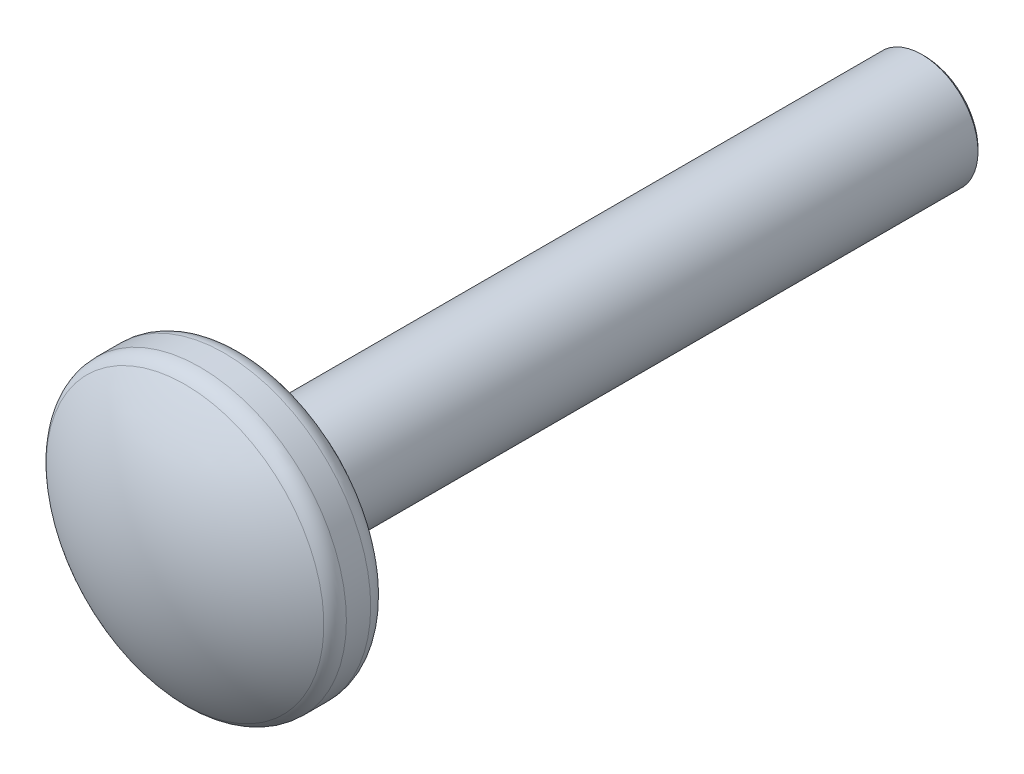
ISO-10303-21;
HEADER;
FILE_DESCRIPTION(('STEP AP214'),'2;1');
FILE_NAME('part.step','',(''),(''),'','','');
FILE_SCHEMA(('AUTOMOTIVE_DESIGN { 1 0 10303 214 1 1 1 1 }'));
ENDSEC;
DATA;
#1=APPLICATION_CONTEXT('core data for automotive mechanical design processes');
#2=APPLICATION_PROTOCOL_DEFINITION('international standard','automotive_design',2000,#1);
#3=PRODUCT_CONTEXT('',#1,'mechanical');
#4=PRODUCT('Part','Part','',(#3));
#5=PRODUCT_RELATED_PRODUCT_CATEGORY('part','',(#4));
#6=PRODUCT_DEFINITION_FORMATION('','',#4);
#7=PRODUCT_DEFINITION_CONTEXT('part definition',#1,'design');
#8=PRODUCT_DEFINITION('design','',#6,#7);
#9=PRODUCT_DEFINITION_SHAPE('','',#8);
#10=(LENGTH_UNIT() NAMED_UNIT(*) SI_UNIT(.MILLI.,.METRE.));
#11=(NAMED_UNIT(*) PLANE_ANGLE_UNIT() SI_UNIT($,.RADIAN.));
#12=(NAMED_UNIT(*) SI_UNIT($,.STERADIAN.) SOLID_ANGLE_UNIT());
#13=UNCERTAINTY_MEASURE_WITH_UNIT(LENGTH_MEASURE(1.E-05),#10,'distance_accuracy_value','');
#14=(GEOMETRIC_REPRESENTATION_CONTEXT(3) GLOBAL_UNCERTAINTY_ASSIGNED_CONTEXT((#13)) GLOBAL_UNIT_ASSIGNED_CONTEXT((#10,
#11,#12)) REPRESENTATION_CONTEXT('',''));
#15=CARTESIAN_POINT('',(0.,0.,0.));
#16=DIRECTION('',(0.,0.,1.));
#17=DIRECTION('',(1.,0.,0.));
#18=AXIS2_PLACEMENT_3D('',#15,#16,#17);
#19=CARTESIAN_POINT('',(0.,0.,18.309669552659));
#20=DIRECTION('',(0.,0.,1.));
#21=DIRECTION('',(1.,0.,0.));
#22=AXIS2_PLACEMENT_3D('',#19,#20,#21);
#23=CYLINDRICAL_SURFACE('',#22,2.69078433849527);
#24=DIRECTION('',(0.,0.,1.));
#25=VECTOR('',#24,1.);
#26=CARTESIAN_POINT('',(0.508,2.64239594994607,18.309669552659));
#27=LINE('',#26,#25);
#28=CARTESIAN_POINT('',(0.508,2.64239594994607,18.309669552659));
#29=VERTEX_POINT('',#28);
#30=CARTESIAN_POINT('',(0.508,2.64239594994607,18.893869552659));
#31=VERTEX_POINT('',#30);
#32=EDGE_CURVE('E63',#29,#31,#27,.T.);
#33=ORIENTED_EDGE('',*,*,#32,.T.);
#34=CARTESIAN_POINT('',(0.,0.,18.893869552659));
#35=DIRECTION('',(0.,0.,1.));
#36=DIRECTION('',(1.,0.,0.));
#37=AXIS2_PLACEMENT_3D('',#34,#35,#36);
#38=CIRCLE('',#37,2.69078433849527);
#39=CARTESIAN_POINT('',(-0.508,2.64239594994607,18.893869552659));
#40=VERTEX_POINT('',#39);
#41=EDGE_CURVE('E50',#40,#31,#38,.T.);
#42=ORIENTED_EDGE('',*,*,#41,.F.);
#43=DIRECTION('',(0.,0.,1.));
#44=VECTOR('',#43,1.);
#45=CARTESIAN_POINT('',(-0.508,2.64239594994607,18.309669552659));
#46=LINE('',#45,#44);
#47=CARTESIAN_POINT('',(-0.508,2.64239594991977,18.309669552659));
#48=VERTEX_POINT('',#47);
#49=EDGE_CURVE('E108',#40,#48,#46,.F.);
#50=ORIENTED_EDGE('',*,*,#49,.T.);
#51=CARTESIAN_POINT('',(0.,0.,18.309669552659));
#52=DIRECTION('',(0.,0.,1.));
#53=DIRECTION('',(1.,0.,0.));
#54=AXIS2_PLACEMENT_3D('',#51,#52,#53);
#55=CIRCLE('',#54,2.69078433849527);
#56=EDGE_CURVE('E13',#48,#29,#55,.T.);
#57=ORIENTED_EDGE('',*,*,#56,.T.);
#58=EDGE_LOOP('',(#33,#42,#50,#57));
#59=FACE_BOUND('',#58,.T.);
#60=ADVANCED_FACE('F47',(#59),#23,.T.);
#61=CARTESIAN_POINT('',(0.,0.,18.309669552659));
#62=DIRECTION('',(0.,0.,1.));
#63=DIRECTION('',(1.,0.,0.));
#64=AXIS2_PLACEMENT_3D('',#61,#62,#63);
#65=PLANE('',#64);
#66=CARTESIAN_POINT('',(0.,0.,18.309669552659));
#67=DIRECTION('',(0.,0.,1.));
#68=DIRECTION('',(1.,0.,0.));
#69=AXIS2_PLACEMENT_3D('',#66,#67,#68);
#70=CIRCLE('',#69,1.56724425180957);
#71=CARTESIAN_POINT('',(1.56724425180957,0.,18.309669552659));
#72=VERTEX_POINT('',#71);
#73=EDGE_CURVE('E119',#72,#72,#70,.T.);
#74=ORIENTED_EDGE('',*,*,#73,.T.);
#75=EDGE_LOOP('',(#74));
#76=FACE_BOUND('',#75,.T.);
#77=ORIENTED_EDGE('',*,*,#56,.F.);
#78=DIRECTION('',(0.,1.,0.));
#79=VECTOR('',#78,1.);
#80=CARTESIAN_POINT('',(-0.508,-500000.,18.309669552659));
#81=LINE('',#80,#79);
#82=CARTESIAN_POINT('',(-0.508,2.69078433849527,18.309669552659));
#83=VERTEX_POINT('',#82);
#84=EDGE_CURVE('E89',#48,#83,#81,.T.);
#85=ORIENTED_EDGE('',*,*,#84,.T.);
#86=DIRECTION('',(-1.,0.,0.));
#87=VECTOR('',#86,1.);
#88=CARTESIAN_POINT('',(0.508,2.69078433849527,18.309669552659));
#89=LINE('',#88,#87);
#90=CARTESIAN_POINT('',(0.508,2.69078433849527,18.309669552659));
#91=VERTEX_POINT('',#90);
#92=EDGE_CURVE('E85',#91,#83,#89,.T.);
#93=ORIENTED_EDGE('',*,*,#92,.F.);
#94=DIRECTION('',(0.,1.,0.));
#95=VECTOR('',#94,1.);
#96=CARTESIAN_POINT('',(0.508,-500000.,18.309669552659));
#97=LINE('',#96,#95);
#98=EDGE_CURVE('E88',#29,#91,#97,.T.);
#99=ORIENTED_EDGE('',*,*,#98,.F.);
#100=EDGE_LOOP('',(#77,#85,#93,#99));
#101=FACE_BOUND('',#100,.T.);
#102=ADVANCED_FACE('F87',(#76,#101),#65,.F.);
#103=CARTESIAN_POINT('',(0.,0.,18.893869552659));
#104=DIRECTION('',(0.,0.,1.));
#105=DIRECTION('',(1.,0.,0.));
#106=AXIS2_PLACEMENT_3D('',#103,#104,#105);
#107=PLANE('',#106);
#108=CARTESIAN_POINT('',(0.,0.,18.893869552659));
#109=DIRECTION('',(0.,0.,1.));
#110=DIRECTION('',(1.,0.,0.));
#111=AXIS2_PLACEMENT_3D('',#108,#109,#110);
#112=CIRCLE('',#111,1.56724425180957);
#113=CARTESIAN_POINT('',(1.56724425180957,0.,18.893869552659));
#114=VERTEX_POINT('',#113);
#115=EDGE_CURVE('E94',#114,#114,#112,.T.);
#116=ORIENTED_EDGE('',*,*,#115,.F.);
#117=EDGE_LOOP('',(#116));
#118=FACE_BOUND('',#117,.T.);
#119=ORIENTED_EDGE('',*,*,#41,.T.);
#120=DIRECTION('',(0.,1.,0.));
#121=VECTOR('',#120,1.);
#122=CARTESIAN_POINT('',(0.508,-500000.,18.893869552659));
#123=LINE('',#122,#121);
#124=CARTESIAN_POINT('',(0.508,2.69078433849527,18.893869552659));
#125=VERTEX_POINT('',#124);
#126=EDGE_CURVE('E102',#31,#125,#123,.T.);
#127=ORIENTED_EDGE('',*,*,#126,.T.);
#128=DIRECTION('',(1.,0.,0.));
#129=VECTOR('',#128,1.);
#130=CARTESIAN_POINT('',(-0.508,2.69078433849527,18.893869552659));
#131=LINE('',#130,#129);
#132=CARTESIAN_POINT('',(-0.508,2.69078433849527,18.893869552659));
#133=VERTEX_POINT('',#132);
#134=EDGE_CURVE('E106',#133,#125,#131,.T.);
#135=ORIENTED_EDGE('',*,*,#134,.F.);
#136=DIRECTION('',(0.,1.,0.));
#137=VECTOR('',#136,1.);
#138=CARTESIAN_POINT('',(-0.508,-500000.,18.893869552659));
#139=LINE('',#138,#137);
#140=EDGE_CURVE('E115',#40,#133,#139,.T.);
#141=ORIENTED_EDGE('',*,*,#140,.F.);
#142=EDGE_LOOP('',(#119,#127,#135,#141));
#143=FACE_BOUND('',#142,.T.);
#144=ADVANCED_FACE('F127',(#118,#143),#107,.T.);
#145=CARTESIAN_POINT('',(0.,0.,18.309669552659));
#146=DIRECTION('',(0.,0.,1.));
#147=DIRECTION('',(1.,0.,0.));
#148=AXIS2_PLACEMENT_3D('',#145,#146,#147);
#149=CYLINDRICAL_SURFACE('',#148,1.56724425180957);
#150=ORIENTED_EDGE('',*,*,#73,.F.);
#151=EDGE_LOOP('',(#150));
#152=FACE_BOUND('',#151,.T.);
#153=ORIENTED_EDGE('',*,*,#115,.T.);
#154=EDGE_LOOP('',(#153));
#155=FACE_BOUND('',#154,.T.);
#156=ADVANCED_FACE('F125',(#152,#155),#149,.F.);
#157=CARTESIAN_POINT('',(-0.508,-500000.,18.309669552659));
#158=DIRECTION('',(-1.,0.,0.));
#159=DIRECTION('',(0.,0.,1.));
#160=AXIS2_PLACEMENT_3D('',#157,#158,#159);
#161=PLANE('',#160);
#162=ORIENTED_EDGE('',*,*,#49,.F.);
#163=ORIENTED_EDGE('',*,*,#140,.T.);
#164=DIRECTION('',(0.,0.,1.));
#165=VECTOR('',#164,1.);
#166=CARTESIAN_POINT('',(-0.508,2.69078433849527,18.309669552659));
#167=LINE('',#166,#165);
#168=EDGE_CURVE('E95',#83,#133,#167,.T.);
#169=ORIENTED_EDGE('',*,*,#168,.F.);
#170=ORIENTED_EDGE('',*,*,#84,.F.);
#171=EDGE_LOOP('',(#162,#163,#169,#170));
#172=FACE_BOUND('',#171,.T.);
#173=ADVANCED_FACE('F132',(#172),#161,.T.);
#174=CARTESIAN_POINT('',(0.508,2.69078433849527,18.309669552659));
#175=DIRECTION('',(0.,1.,0.));
#176=DIRECTION('',(0.,0.,1.));
#177=AXIS2_PLACEMENT_3D('',#174,#175,#176);
#178=PLANE('',#177);
#179=ORIENTED_EDGE('',*,*,#134,.T.);
#180=DIRECTION('',(0.,0.,-1.));
#181=VECTOR('',#180,1.);
#182=CARTESIAN_POINT('',(0.508,2.69078433849527,18.893869552659));
#183=LINE('',#182,#181);
#184=EDGE_CURVE('E101',#125,#91,#183,.T.);
#185=ORIENTED_EDGE('',*,*,#184,.T.);
#186=ORIENTED_EDGE('',*,*,#92,.T.);
#187=ORIENTED_EDGE('',*,*,#168,.T.);
#188=EDGE_LOOP('',(#179,#185,#186,#187));
#189=FACE_BOUND('',#188,.T.);
#190=ADVANCED_FACE('F104',(#189),#178,.T.);
#191=CARTESIAN_POINT('',(0.508,-500000.,18.893869552659));
#192=DIRECTION('',(1.,0.,0.));
#193=DIRECTION('',(0.,0.,-1.));
#194=AXIS2_PLACEMENT_3D('',#191,#192,#193);
#195=PLANE('',#194);
#196=ORIENTED_EDGE('',*,*,#32,.F.);
#197=ORIENTED_EDGE('',*,*,#98,.T.);
#198=ORIENTED_EDGE('',*,*,#184,.F.);
#199=ORIENTED_EDGE('',*,*,#126,.F.);
#200=EDGE_LOOP('',(#196,#197,#198,#199));
#201=FACE_BOUND('',#200,.T.);
#202=ADVANCED_FACE('F99',(#201),#195,.T.);
#203=CLOSED_SHELL('',(#60,#102,#144,#156,#173,#190,#202));
#204=MANIFOLD_SOLID_BREP('B2',#203);
#205=CARTESIAN_POINT('',(0.,0.,19.05));
#206=DIRECTION('',(0.,0.,-1.));
#207=DIRECTION('',(-1.,0.,0.));
#208=AXIS2_PLACEMENT_3D('',#205,#206,#207);
#209=PLANE('',#208);
#210=CARTESIAN_POINT('',(0.,0.,19.05));
#211=DIRECTION('',(0.,0.,-1.));
#212=DIRECTION('',(-1.,0.,0.));
#213=AXIS2_PLACEMENT_3D('',#210,#211,#212);
#214=CIRCLE('',#213,1.56724425180958);
#215=CARTESIAN_POINT('',(-1.56724425180958,0.,19.05));
#216=VERTEX_POINT('',#215);
#217=EDGE_CURVE('E223',#216,#216,#214,.F.);
#218=ORIENTED_EDGE('',*,*,#217,.T.);
#219=EDGE_LOOP('',(#218));
#220=FACE_BOUND('',#219,.T.);
#221=CARTESIAN_POINT('',(0.,0.,19.05));
#222=DIRECTION('',(0.,0.,1.));
#223=DIRECTION('',(0.,-1.,0.));
#224=AXIS2_PLACEMENT_3D('',#221,#222,#223);
#225=CIRCLE('',#224,3.56362);
#226=CARTESIAN_POINT('',(0.,-3.56362,19.05));
#227=VERTEX_POINT('',#226);
#228=EDGE_CURVE('E312',#227,#227,#225,.T.);
#229=ORIENTED_EDGE('',*,*,#228,.F.);
#230=EDGE_LOOP('',(#229));
#231=FACE_BOUND('',#230,.T.);
#232=ADVANCED_FACE('F203',(#220,#231),#209,.T.);
#233=CARTESIAN_POINT('',(0.,0.,0.));
#234=DIRECTION('',(0.,0.,-1.));
#235=DIRECTION('',(0.,1.,0.));
#236=AXIS2_PLACEMENT_3D('',#233,#234,#235);
#237=CYLINDRICAL_SURFACE('',#236,1.56724425180958);
#238=ORIENTED_EDGE('',*,*,#217,.F.);
#239=EDGE_LOOP('',(#238));
#240=FACE_BOUND('',#239,.T.);
#241=CARTESIAN_POINT('',(0.,0.,0.0797567518095764));
#242=DIRECTION('',(0.,0.,1.));
#243=DIRECTION('',(1.,0.,0.));
#244=AXIS2_PLACEMENT_3D('',#241,#242,#243);
#245=CIRCLE('',#244,1.56724425180958);
#246=CARTESIAN_POINT('',(1.56724425180958,0.,0.0797567518095764));
#247=VERTEX_POINT('',#246);
#248=EDGE_CURVE('E45',#247,#247,#245,.T.);
#249=ORIENTED_EDGE('',*,*,#248,.T.);
#250=EDGE_LOOP('',(#249));
#251=FACE_BOUND('',#250,.T.);
#252=ADVANCED_FACE('F238',(#240,#251),#237,.T.);
#253=CARTESIAN_POINT('',(0.,0.,0.));
#254=DIRECTION('',(0.,0.,1.));
#255=DIRECTION('',(-1.,0.,0.));
#256=AXIS2_PLACEMENT_3D('',#253,#254,#255);
#257=CONICAL_SURFACE('',#256,1.4874875,0.78539816339745);
#258=ORIENTED_EDGE('',*,*,#248,.F.);
#259=EDGE_LOOP('',(#258));
#260=FACE_BOUND('',#259,.T.);
#261=CARTESIAN_POINT('',(0.,0.,0.));
#262=DIRECTION('',(0.,0.,-1.));
#263=DIRECTION('',(-1.,0.,0.));
#264=AXIS2_PLACEMENT_3D('',#261,#262,#263);
#265=CIRCLE('',#264,1.4874875);
#266=CARTESIAN_POINT('',(-1.4874875,0.,0.));
#267=VERTEX_POINT('',#266);
#268=EDGE_CURVE('E210',#267,#267,#265,.T.);
#269=ORIENTED_EDGE('',*,*,#268,.F.);
#270=EDGE_LOOP('',(#269));
#271=FACE_BOUND('',#270,.T.);
#272=ADVANCED_FACE('F236',(#260,#271),#257,.T.);
#273=CARTESIAN_POINT('',(0.,0.,0.));
#274=DIRECTION('',(0.,0.,-1.));
#275=DIRECTION('',(0.,1.,0.));
#276=AXIS2_PLACEMENT_3D('',#273,#274,#275);
#277=PLANE('',#276);
#278=ORIENTED_EDGE('',*,*,#268,.T.);
#279=EDGE_LOOP('',(#278));
#280=FACE_BOUND('',#279,.T.);
#281=ADVANCED_FACE('F205',(#280),#277,.T.);
#282=CARTESIAN_POINT('',(0.,0.,19.57578));
#283=DIRECTION('',(0.,0.,1.));
#284=DIRECTION('',(0.,-1.,0.));
#285=AXIS2_PLACEMENT_3D('',#282,#283,#284);
#286=TOROIDAL_SURFACE('',#285,3.56362,0.525779999999998);
#287=ORIENTED_EDGE('',*,*,#228,.T.);
#288=EDGE_LOOP('',(#287));
#289=FACE_BOUND('',#288,.T.);
#290=CARTESIAN_POINT('',(0.,0.,19.57578));
#291=DIRECTION('',(0.,0.,1.));
#292=DIRECTION('',(0.,-1.,0.));
#293=AXIS2_PLACEMENT_3D('',#290,#291,#292);
#294=CIRCLE('',#293,4.0894);
#295=CARTESIAN_POINT('',(0.,-4.0894,19.57578));
#296=VERTEX_POINT('',#295);
#297=EDGE_CURVE('E229',#296,#296,#294,.T.);
#298=ORIENTED_EDGE('',*,*,#297,.F.);
#299=EDGE_LOOP('',(#298));
#300=FACE_BOUND('',#299,.T.);
#301=ADVANCED_FACE('F245',(#289,#300),#286,.T.);
#302=CARTESIAN_POINT('',(0.,0.,0.));
#303=DIRECTION('',(0.,0.,-1.));
#304=DIRECTION('',(-1.,0.,0.));
#305=AXIS2_PLACEMENT_3D('',#302,#303,#304);
#306=CYLINDRICAL_SURFACE('',#305,4.0894);
#307=ORIENTED_EDGE('',*,*,#297,.T.);
#308=EDGE_LOOP('',(#307));
#309=FACE_BOUND('',#308,.T.);
#310=CARTESIAN_POINT('',(0.,0.,20.2549068740336));
#311=DIRECTION('',(0.,0.,1.));
#312=DIRECTION('',(0.,-1.,0.));
#313=AXIS2_PLACEMENT_3D('',#310,#311,#312);
#314=CIRCLE('',#313,4.0894);
#315=CARTESIAN_POINT('',(0.,-4.0894,20.2549068740336));
#316=VERTEX_POINT('',#315);
#317=EDGE_CURVE('E224',#316,#316,#314,.T.);
#318=ORIENTED_EDGE('',*,*,#317,.F.);
#319=EDGE_LOOP('',(#318));
#320=FACE_BOUND('',#319,.T.);
#321=ADVANCED_FACE('F217',(#309,#320),#306,.T.);
#322=CARTESIAN_POINT('',(0.,0.,15.51559));
#323=DIRECTION('',(0.,0.,1.));
#324=DIRECTION('',(0.,1.,0.));
#325=AXIS2_PLACEMENT_3D('',#322,#323,#324);
#326=SPHERICAL_SURFACE('',#325,6.45541);
#327=CARTESIAN_POINT('',(0.,0.,21.971));
#328=VERTEX_POINT('',#327);
#329=VERTEX_LOOP('',#328);
#330=FACE_BOUND('',#329,.T.);
#331=CARTESIAN_POINT('',(0.,0.,20.6751418677903));
#332=DIRECTION('',(0.,0.,1.));
#333=DIRECTION('',(0.,-1.,0.));
#334=AXIS2_PLACEMENT_3D('',#331,#332,#333);
#335=CIRCLE('',#334,3.87960600985222);
#336=CARTESIAN_POINT('',(0.,-3.87960600985222,20.6751418677903));
#337=VERTEX_POINT('',#336);
#338=EDGE_CURVE('E221',#337,#337,#335,.T.);
#339=ORIENTED_EDGE('',*,*,#338,.T.);
#340=EDGE_LOOP('',(#339));
#341=FACE_BOUND('',#340,.T.);
#342=ADVANCED_FACE('F213',(#330,#341),#326,.T.);
#343=CARTESIAN_POINT('',(0.,0.,20.2549068740336));
#344=DIRECTION('',(0.,0.,1.));
#345=DIRECTION('',(0.,-1.,0.));
#346=AXIS2_PLACEMENT_3D('',#343,#344,#345);
#347=TOROIDAL_SURFACE('',#346,3.56362,0.525780000000001);
#348=ORIENTED_EDGE('',*,*,#317,.T.);
#349=EDGE_LOOP('',(#348));
#350=FACE_BOUND('',#349,.T.);
#351=ORIENTED_EDGE('',*,*,#338,.F.);
#352=EDGE_LOOP('',(#351));
#353=FACE_BOUND('',#352,.T.);
#354=ADVANCED_FACE('F216',(#350,#353),#347,.T.);
#355=CLOSED_SHELL('',(#232,#252,#272,#281,#301,#321,#342,#354));
#356=MANIFOLD_SOLID_BREP('B7',#355);
#357=ADVANCED_BREP_SHAPE_REPRESENTATION('',(#18,#204,#356),#14);
#358=SHAPE_DEFINITION_REPRESENTATION(#9,#357);
ENDSEC;
END-ISO-10303-21;
